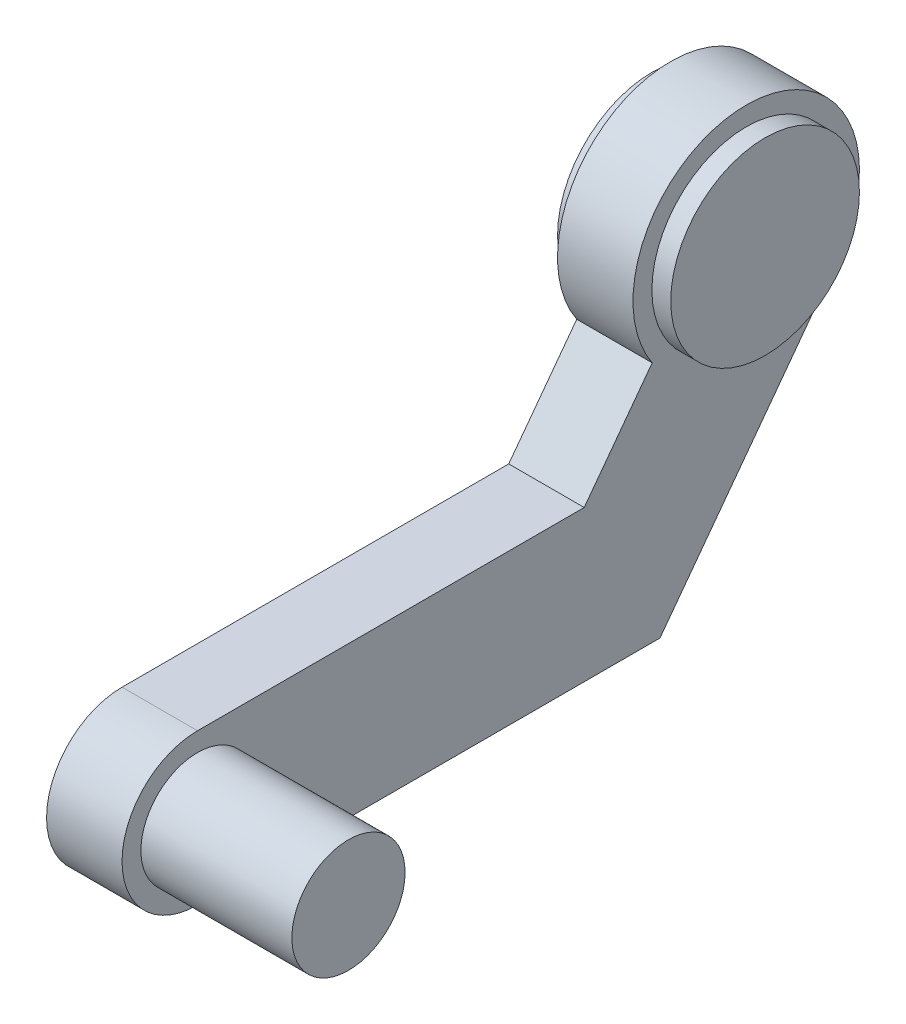
ISO-10303-21;
HEADER;
FILE_DESCRIPTION(('STEP AP214'),'2;1');
FILE_NAME('part.step','',(''),(''),'','','');
FILE_SCHEMA(('AUTOMOTIVE_DESIGN { 1 0 10303 214 1 1 1 1 }'));
ENDSEC;
DATA;
#1=APPLICATION_CONTEXT('core data for automotive mechanical design processes');
#2=APPLICATION_PROTOCOL_DEFINITION('international standard','automotive_design',2000,#1);
#3=PRODUCT_CONTEXT('',#1,'mechanical');
#4=PRODUCT('Part','Part','',(#3));
#5=PRODUCT_RELATED_PRODUCT_CATEGORY('part','',(#4));
#6=PRODUCT_DEFINITION_FORMATION('','',#4);
#7=PRODUCT_DEFINITION_CONTEXT('part definition',#1,'design');
#8=PRODUCT_DEFINITION('design','',#6,#7);
#9=PRODUCT_DEFINITION_SHAPE('','',#8);
#10=(LENGTH_UNIT() NAMED_UNIT(*) SI_UNIT(.MILLI.,.METRE.));
#11=(NAMED_UNIT(*) PLANE_ANGLE_UNIT() SI_UNIT($,.RADIAN.));
#12=(NAMED_UNIT(*) SI_UNIT($,.STERADIAN.) SOLID_ANGLE_UNIT());
#13=UNCERTAINTY_MEASURE_WITH_UNIT(LENGTH_MEASURE(1.E-05),#10,'distance_accuracy_value','');
#14=(GEOMETRIC_REPRESENTATION_CONTEXT(3) GLOBAL_UNCERTAINTY_ASSIGNED_CONTEXT((#13)) GLOBAL_UNIT_ASSIGNED_CONTEXT((#10,
#11,#12)) REPRESENTATION_CONTEXT('',''));
#15=CARTESIAN_POINT('',(0.,0.,0.));
#16=DIRECTION('',(0.,0.,1.));
#17=DIRECTION('',(1.,0.,0.));
#18=AXIS2_PLACEMENT_3D('',#15,#16,#17);
#19=CARTESIAN_POINT('',(2.,-8.17999999999999,0.));
#20=DIRECTION('',(0.,1.,0.));
#21=DIRECTION('',(0.,0.,1.));
#22=AXIS2_PLACEMENT_3D('',#19,#20,#21);
#23=PLANE('',#22);
#24=DIRECTION('',(0.,0.,-1.));
#25=VECTOR('',#24,1.);
#26=CARTESIAN_POINT('',(-2.,-8.17999999999999,0.));
#27=LINE('',#26,#25);
#28=CARTESIAN_POINT('',(-2.,-8.18,29.08));
#29=VERTEX_POINT('',#28);
#30=CARTESIAN_POINT('',(-2.,-8.17999999999999,8.5865581848066));
#31=VERTEX_POINT('',#30);
#32=EDGE_CURVE('E135',#29,#31,#27,.T.);
#33=ORIENTED_EDGE('',*,*,#32,.F.);
#34=DIRECTION('',(-1.,0.,0.));
#35=VECTOR('',#34,1.);
#36=CARTESIAN_POINT('',(2.,-8.18,29.08));
#37=LINE('',#36,#35);
#38=CARTESIAN_POINT('',(2.,-8.18,29.08));
#39=VERTEX_POINT('',#38);
#40=EDGE_CURVE('E11',#39,#29,#37,.T.);
#41=ORIENTED_EDGE('',*,*,#40,.F.);
#42=DIRECTION('',(0.,0.,-1.));
#43=VECTOR('',#42,1.);
#44=CARTESIAN_POINT('',(2.,-8.17999999999999,0.));
#45=LINE('',#44,#43);
#46=CARTESIAN_POINT('',(2.,-8.17999999999999,8.5865581848066));
#47=VERTEX_POINT('',#46);
#48=EDGE_CURVE('E144',#39,#47,#45,.T.);
#49=ORIENTED_EDGE('',*,*,#48,.T.);
#50=DIRECTION('',(-1.,0.,0.));
#51=VECTOR('',#50,1.);
#52=CARTESIAN_POINT('',(2.,-8.17999999999999,8.5865581848066));
#53=LINE('',#52,#51);
#54=EDGE_CURVE('E56',#47,#31,#53,.T.);
#55=ORIENTED_EDGE('',*,*,#54,.T.);
#56=EDGE_LOOP('',(#33,#41,#49,#55));
#57=FACE_BOUND('',#56,.T.);
#58=ADVANCED_FACE('F43',(#57),#23,.T.);
#59=CARTESIAN_POINT('',(2.,-12.18,29.08));
#60=DIRECTION('',(-1.,0.,0.));
#61=DIRECTION('',(0.,0.,1.));
#62=AXIS2_PLACEMENT_3D('',#59,#60,#61);
#63=CYLINDRICAL_SURFACE('',#62,4.);
#64=CARTESIAN_POINT('',(-2.,-12.18,29.08));
#65=DIRECTION('',(1.,0.,0.));
#66=DIRECTION('',(0.,0.,-1.));
#67=AXIS2_PLACEMENT_3D('',#64,#65,#66);
#68=CIRCLE('',#67,4.);
#69=CARTESIAN_POINT('',(-2.,-16.18,29.08));
#70=VERTEX_POINT('',#69);
#71=EDGE_CURVE('E133',#29,#70,#68,.T.);
#72=ORIENTED_EDGE('',*,*,#71,.T.);
#73=DIRECTION('',(-1.,0.,0.));
#74=VECTOR('',#73,1.);
#75=CARTESIAN_POINT('',(2.,-16.18,29.08));
#76=LINE('',#75,#74);
#77=CARTESIAN_POINT('',(2.,-16.18,29.08));
#78=VERTEX_POINT('',#77);
#79=EDGE_CURVE('E51',#78,#70,#76,.T.);
#80=ORIENTED_EDGE('',*,*,#79,.F.);
#81=CARTESIAN_POINT('',(2.,-12.18,29.08));
#82=DIRECTION('',(1.,0.,0.));
#83=DIRECTION('',(0.,0.,-1.));
#84=AXIS2_PLACEMENT_3D('',#81,#82,#83);
#85=CIRCLE('',#84,4.);
#86=EDGE_CURVE('E297',#39,#78,#85,.T.);
#87=ORIENTED_EDGE('',*,*,#86,.F.);
#88=ORIENTED_EDGE('',*,*,#40,.T.);
#89=EDGE_LOOP('',(#72,#80,#87,#88));
#90=FACE_BOUND('',#89,.T.);
#91=ADVANCED_FACE('F166',(#90),#63,.T.);
#92=CARTESIAN_POINT('',(2.,-16.18,0.));
#93=DIRECTION('',(0.,1.,0.));
#94=DIRECTION('',(0.,0.,1.));
#95=AXIS2_PLACEMENT_3D('',#92,#93,#94);
#96=PLANE('',#95);
#97=DIRECTION('',(0.,0.,-1.));
#98=VECTOR('',#97,1.);
#99=CARTESIAN_POINT('',(-2.,-16.18,0.));
#100=LINE('',#99,#98);
#101=CARTESIAN_POINT('',(-2.,-16.18,4.56997273136095));
#102=VERTEX_POINT('',#101);
#103=EDGE_CURVE('E136',#70,#102,#100,.T.);
#104=ORIENTED_EDGE('',*,*,#103,.T.);
#105=DIRECTION('',(-1.,0.,0.));
#106=VECTOR('',#105,1.);
#107=CARTESIAN_POINT('',(2.,-16.18,4.56997273136095));
#108=LINE('',#107,#106);
#109=CARTESIAN_POINT('',(2.,-16.18,4.56997273136095));
#110=VERTEX_POINT('',#109);
#111=EDGE_CURVE('E117',#110,#102,#108,.T.);
#112=ORIENTED_EDGE('',*,*,#111,.F.);
#113=DIRECTION('',(0.,0.,-1.));
#114=VECTOR('',#113,1.);
#115=CARTESIAN_POINT('',(2.,-16.18,0.));
#116=LINE('',#115,#114);
#117=EDGE_CURVE('E106',#78,#110,#116,.T.);
#118=ORIENTED_EDGE('',*,*,#117,.F.);
#119=ORIENTED_EDGE('',*,*,#79,.T.);
#120=EDGE_LOOP('',(#104,#112,#118,#119));
#121=FACE_BOUND('',#120,.T.);
#122=ADVANCED_FACE('F155',(#121),#96,.F.);
#123=CARTESIAN_POINT('',(2.,-3.58407142844829,-4.81190523553619));
#124=DIRECTION('',(0.,0.597345238074716,0.801984205922699));
#125=DIRECTION('',(0.,-0.801984205922699,0.597345238074716));
#126=AXIS2_PLACEMENT_3D('',#123,#124,#125);
#127=PLANE('',#126);
#128=DIRECTION('',(0.,0.801984205922698,-0.597345238074716));
#129=VECTOR('',#128,1.);
#130=CARTESIAN_POINT('',(-2.,-3.58407142844829,-4.81190523553619));
#131=LINE('',#130,#129);
#132=CARTESIAN_POINT('',(-2.,-3.58407142844829,-4.81190523553619));
#133=VERTEX_POINT('',#132);
#134=EDGE_CURVE('E113',#102,#133,#131,.T.);
#135=ORIENTED_EDGE('',*,*,#134,.T.);
#136=DIRECTION('',(-1.,0.,0.));
#137=VECTOR('',#136,1.);
#138=CARTESIAN_POINT('',(2.,-3.58407142844829,-4.81190523553619));
#139=LINE('',#138,#137);
#140=CARTESIAN_POINT('',(2.,-3.58407142844829,-4.81190523553619));
#141=VERTEX_POINT('',#140);
#142=EDGE_CURVE('E115',#141,#133,#139,.T.);
#143=ORIENTED_EDGE('',*,*,#142,.F.);
#144=DIRECTION('',(0.,0.801984205922698,-0.597345238074716));
#145=VECTOR('',#144,1.);
#146=CARTESIAN_POINT('',(2.,-3.58407142844829,-4.81190523553619));
#147=LINE('',#146,#145);
#148=EDGE_CURVE('E100',#110,#141,#147,.T.);
#149=ORIENTED_EDGE('',*,*,#148,.F.);
#150=ORIENTED_EDGE('',*,*,#111,.T.);
#151=EDGE_LOOP('',(#135,#143,#149,#150));
#152=FACE_BOUND('',#151,.T.);
#153=ADVANCED_FACE('F114',(#152),#127,.F.);
#154=CARTESIAN_POINT('',(2.,0.,0.));
#155=DIRECTION('',(-1.,0.,0.));
#156=DIRECTION('',(0.,0.,1.));
#157=AXIS2_PLACEMENT_3D('',#154,#155,#156);
#158=CYLINDRICAL_SURFACE('',#157,6.);
#159=CARTESIAN_POINT('',(-2.,0.,0.));
#160=DIRECTION('',(1.,0.,0.));
#161=DIRECTION('',(0.,0.,-1.));
#162=AXIS2_PLACEMENT_3D('',#159,#160,#161);
#163=CIRCLE('',#162,6.);
#164=CARTESIAN_POINT('',(-2.,-3.34201728715016,4.98306336026239));
#165=VERTEX_POINT('',#164);
#166=EDGE_CURVE('E137',#133,#165,#163,.T.);
#167=ORIENTED_EDGE('',*,*,#166,.T.);
#168=DIRECTION('',(-1.,0.,0.));
#169=VECTOR('',#168,1.);
#170=CARTESIAN_POINT('',(2.,-3.34201728715016,4.98306336026239));
#171=LINE('',#170,#169);
#172=CARTESIAN_POINT('',(2.,-3.34201728715016,4.98306336026239));
#173=VERTEX_POINT('',#172);
#174=EDGE_CURVE('E78',#173,#165,#171,.T.);
#175=ORIENTED_EDGE('',*,*,#174,.F.);
#176=CARTESIAN_POINT('',(2.,0.,0.));
#177=DIRECTION('',(1.,0.,0.));
#178=DIRECTION('',(0.,0.,-1.));
#179=AXIS2_PLACEMENT_3D('',#176,#177,#178);
#180=CIRCLE('',#179,6.);
#181=EDGE_CURVE('E102',#141,#173,#180,.T.);
#182=ORIENTED_EDGE('',*,*,#181,.F.);
#183=ORIENTED_EDGE('',*,*,#142,.T.);
#184=EDGE_LOOP('',(#167,#175,#182,#183));
#185=FACE_BOUND('',#184,.T.);
#186=ADVANCED_FACE('F119',(#185),#158,.T.);
#187=CARTESIAN_POINT('',(2.,1.19469047614943,1.6039684118454));
#188=DIRECTION('',(0.,0.597345238074716,0.801984205922699));
#189=DIRECTION('',(0.,-0.801984205922699,0.597345238074716));
#190=AXIS2_PLACEMENT_3D('',#187,#188,#189);
#191=PLANE('',#190);
#192=DIRECTION('',(0.,0.801984205922699,-0.597345238074716));
#193=VECTOR('',#192,1.);
#194=CARTESIAN_POINT('',(-2.,1.19469047614943,1.6039684118454));
#195=LINE('',#194,#193);
#196=EDGE_CURVE('E142',#31,#165,#195,.T.);
#197=ORIENTED_EDGE('',*,*,#196,.F.);
#198=ORIENTED_EDGE('',*,*,#54,.F.);
#199=DIRECTION('',(0.,0.801984205922699,-0.597345238074716));
#200=VECTOR('',#199,1.);
#201=CARTESIAN_POINT('',(2.,1.19469047614943,1.6039684118454));
#202=LINE('',#201,#200);
#203=EDGE_CURVE('E121',#47,#173,#202,.T.);
#204=ORIENTED_EDGE('',*,*,#203,.T.);
#205=ORIENTED_EDGE('',*,*,#174,.T.);
#206=EDGE_LOOP('',(#197,#198,#204,#205));
#207=FACE_BOUND('',#206,.T.);
#208=ADVANCED_FACE('F158',(#207),#191,.T.);
#209=CARTESIAN_POINT('',(2.,0.,0.));
#210=DIRECTION('',(1.,0.,0.));
#211=DIRECTION('',(0.,0.,-1.));
#212=AXIS2_PLACEMENT_3D('',#209,#210,#211);
#213=PLANE('',#212);
#214=ORIENTED_EDGE('',*,*,#48,.F.);
#215=ORIENTED_EDGE('',*,*,#86,.T.);
#216=ORIENTED_EDGE('',*,*,#117,.T.);
#217=ORIENTED_EDGE('',*,*,#148,.T.);
#218=ORIENTED_EDGE('',*,*,#181,.T.);
#219=ORIENTED_EDGE('',*,*,#203,.F.);
#220=EDGE_LOOP('',(#214,#215,#216,#217,#218,#219));
#221=FACE_BOUND('',#220,.T.);
#222=CARTESIAN_POINT('',(2.,0.,0.));
#223=DIRECTION('',(1.,0.,0.));
#224=DIRECTION('',(0.,0.,-1.));
#225=AXIS2_PLACEMENT_3D('',#222,#223,#224);
#226=CIRCLE('',#225,5.);
#227=CARTESIAN_POINT('',(2.,0.,-5.));
#228=VERTEX_POINT('',#227);
#229=EDGE_CURVE('E122',#228,#228,#226,.T.);
#230=ORIENTED_EDGE('',*,*,#229,.F.);
#231=EDGE_LOOP('',(#230));
#232=FACE_BOUND('',#231,.T.);
#233=CARTESIAN_POINT('',(2.,-12.18,29.08));
#234=DIRECTION('',(1.,0.,0.));
#235=DIRECTION('',(0.,0.,-1.));
#236=AXIS2_PLACEMENT_3D('',#233,#234,#235);
#237=CIRCLE('',#236,3.);
#238=CARTESIAN_POINT('',(2.,-12.18,26.08));
#239=VERTEX_POINT('',#238);
#240=EDGE_CURVE('E129',#239,#239,#237,.T.);
#241=ORIENTED_EDGE('',*,*,#240,.F.);
#242=EDGE_LOOP('',(#241));
#243=FACE_BOUND('',#242,.T.);
#244=ADVANCED_FACE('F99',(#221,#232,#243),#213,.T.);
#245=CARTESIAN_POINT('',(-2.,0.,0.));
#246=DIRECTION('',(1.,0.,0.));
#247=DIRECTION('',(0.,0.,-1.));
#248=AXIS2_PLACEMENT_3D('',#245,#246,#247);
#249=PLANE('',#248);
#250=ORIENTED_EDGE('',*,*,#32,.T.);
#251=ORIENTED_EDGE('',*,*,#196,.T.);
#252=ORIENTED_EDGE('',*,*,#166,.F.);
#253=ORIENTED_EDGE('',*,*,#134,.F.);
#254=ORIENTED_EDGE('',*,*,#103,.F.);
#255=ORIENTED_EDGE('',*,*,#71,.F.);
#256=EDGE_LOOP('',(#250,#251,#252,#253,#254,#255));
#257=FACE_BOUND('',#256,.T.);
#258=CARTESIAN_POINT('',(-2.,0.,0.));
#259=DIRECTION('',(1.,0.,0.));
#260=DIRECTION('',(0.,0.,-1.));
#261=AXIS2_PLACEMENT_3D('',#258,#259,#260);
#262=CIRCLE('',#261,5.);
#263=CARTESIAN_POINT('',(-2.,0.,-5.));
#264=VERTEX_POINT('',#263);
#265=EDGE_CURVE('E134',#264,#264,#262,.F.);
#266=ORIENTED_EDGE('',*,*,#265,.F.);
#267=EDGE_LOOP('',(#266));
#268=FACE_BOUND('',#267,.T.);
#269=ADVANCED_FACE('F156',(#257,#268),#249,.F.);
#270=CARTESIAN_POINT('',(-3.,0.,0.));
#271=DIRECTION('',(1.,0.,0.));
#272=DIRECTION('',(0.,0.,-1.));
#273=AXIS2_PLACEMENT_3D('',#270,#271,#272);
#274=PLANE('',#273);
#275=CARTESIAN_POINT('',(-3.,0.,0.));
#276=DIRECTION('',(1.,0.,0.));
#277=DIRECTION('',(0.,0.,-1.));
#278=AXIS2_PLACEMENT_3D('',#275,#276,#277);
#279=CIRCLE('',#278,5.);
#280=CARTESIAN_POINT('',(-3.,0.,-5.));
#281=VERTEX_POINT('',#280);
#282=EDGE_CURVE('E290',#281,#281,#279,.T.);
#283=ORIENTED_EDGE('',*,*,#282,.F.);
#284=EDGE_LOOP('',(#283));
#285=FACE_BOUND('',#284,.T.);
#286=ADVANCED_FACE('F214',(#285),#274,.F.);
#287=CARTESIAN_POINT('',(3.,0.,0.));
#288=DIRECTION('',(-1.,0.,0.));
#289=DIRECTION('',(0.,0.,1.));
#290=AXIS2_PLACEMENT_3D('',#287,#288,#289);
#291=CYLINDRICAL_SURFACE('',#290,5.);
#292=ORIENTED_EDGE('',*,*,#282,.T.);
#293=EDGE_LOOP('',(#292));
#294=FACE_BOUND('',#293,.T.);
#295=ORIENTED_EDGE('',*,*,#265,.T.);
#296=EDGE_LOOP('',(#295));
#297=FACE_BOUND('',#296,.T.);
#298=ADVANCED_FACE('F235',(#294,#297),#291,.T.);
#299=ORIENTED_EDGE('',*,*,#229,.T.);
#300=EDGE_LOOP('',(#299));
#301=FACE_BOUND('',#300,.T.);
#302=CARTESIAN_POINT('',(3.,0.,0.));
#303=DIRECTION('',(1.,0.,0.));
#304=DIRECTION('',(0.,0.,-1.));
#305=AXIS2_PLACEMENT_3D('',#302,#303,#304);
#306=CIRCLE('',#305,5.);
#307=CARTESIAN_POINT('',(3.,0.,-5.));
#308=VERTEX_POINT('',#307);
#309=EDGE_CURVE('E289',#308,#308,#306,.T.);
#310=ORIENTED_EDGE('',*,*,#309,.F.);
#311=EDGE_LOOP('',(#310));
#312=FACE_BOUND('',#311,.T.);
#313=ADVANCED_FACE('F245',(#301,#312),#291,.T.);
#314=CARTESIAN_POINT('',(3.,0.,0.));
#315=DIRECTION('',(1.,0.,0.));
#316=DIRECTION('',(0.,0.,-1.));
#317=AXIS2_PLACEMENT_3D('',#314,#315,#316);
#318=PLANE('',#317);
#319=ORIENTED_EDGE('',*,*,#309,.T.);
#320=EDGE_LOOP('',(#319));
#321=FACE_BOUND('',#320,.T.);
#322=ADVANCED_FACE('F253',(#321),#318,.T.);
#323=CARTESIAN_POINT('',(9.99999999999999,-12.18,29.08));
#324=DIRECTION('',(-1.,0.,0.));
#325=DIRECTION('',(0.,0.,1.));
#326=AXIS2_PLACEMENT_3D('',#323,#324,#325);
#327=CYLINDRICAL_SURFACE('',#326,3.);
#328=ORIENTED_EDGE('',*,*,#240,.T.);
#329=EDGE_LOOP('',(#328));
#330=FACE_BOUND('',#329,.T.);
#331=CARTESIAN_POINT('',(9.99999999999999,-12.18,29.08));
#332=DIRECTION('',(1.,0.,0.));
#333=DIRECTION('',(0.,0.,-1.));
#334=AXIS2_PLACEMENT_3D('',#331,#332,#333);
#335=CIRCLE('',#334,3.);
#336=CARTESIAN_POINT('',(9.99999999999999,-12.18,26.08));
#337=VERTEX_POINT('',#336);
#338=EDGE_CURVE('E284',#337,#337,#335,.T.);
#339=ORIENTED_EDGE('',*,*,#338,.F.);
#340=EDGE_LOOP('',(#339));
#341=FACE_BOUND('',#340,.T.);
#342=ADVANCED_FACE('F259',(#330,#341),#327,.T.);
#343=CARTESIAN_POINT('',(9.99999999999999,-12.18,29.08));
#344=DIRECTION('',(1.,0.,0.));
#345=DIRECTION('',(0.,0.,-1.));
#346=AXIS2_PLACEMENT_3D('',#343,#344,#345);
#347=PLANE('',#346);
#348=ORIENTED_EDGE('',*,*,#338,.T.);
#349=EDGE_LOOP('',(#348));
#350=FACE_BOUND('',#349,.T.);
#351=ADVANCED_FACE('F267',(#350),#347,.T.);
#352=CLOSED_SHELL('',(#58,#91,#122,#153,#186,#208,#244,#269,#286,#298,#313,#322,#342,#351));
#353=MANIFOLD_SOLID_BREP('B2',#352);
#354=ADVANCED_BREP_SHAPE_REPRESENTATION('',(#18,#353),#14);
#355=SHAPE_DEFINITION_REPRESENTATION(#9,#354);
ENDSEC;
END-ISO-10303-21;
